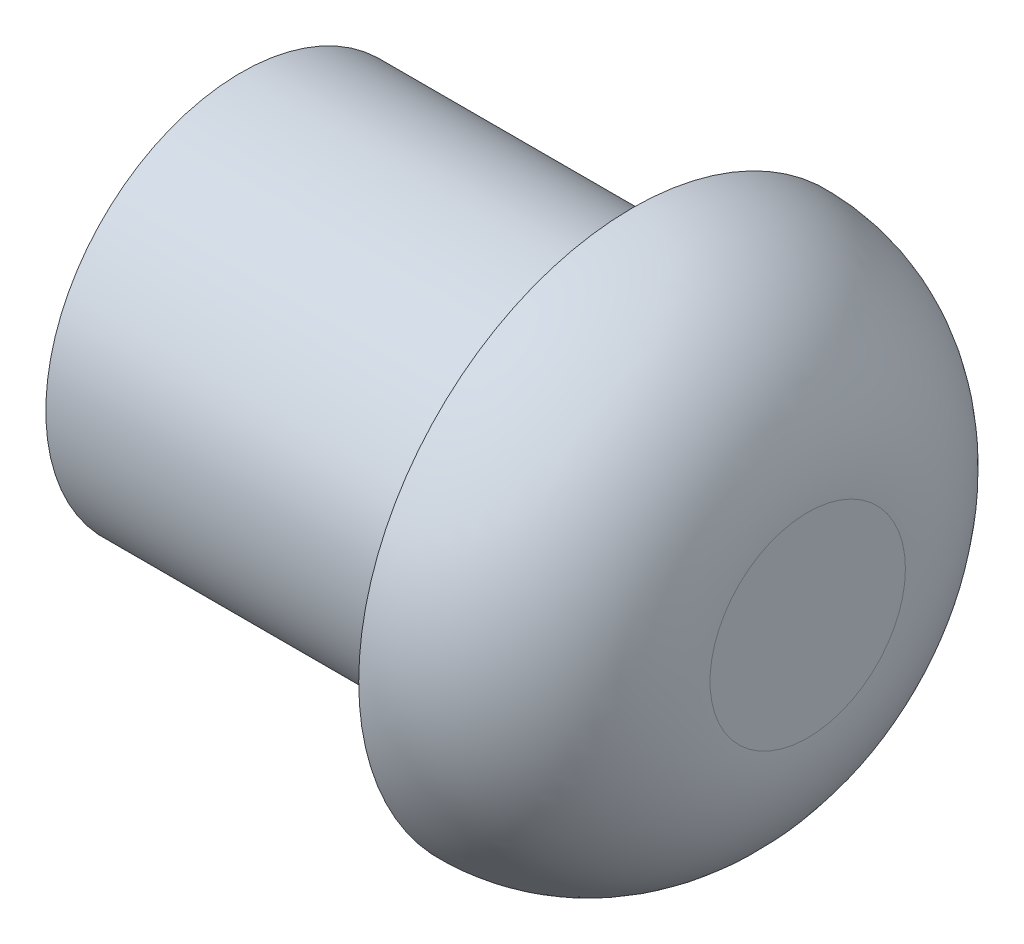
ISO-10303-21;
HEADER;
FILE_DESCRIPTION(('STEP AP214'),'2;1');
FILE_NAME('part.step','',(''),(''),'','','');
FILE_SCHEMA(('AUTOMOTIVE_DESIGN { 1 0 10303 214 1 1 1 1 }'));
ENDSEC;
DATA;
#1=APPLICATION_CONTEXT('core data for automotive mechanical design processes');
#2=APPLICATION_PROTOCOL_DEFINITION('international standard','automotive_design',2000,#1);
#3=PRODUCT_CONTEXT('',#1,'mechanical');
#4=PRODUCT('Part','Part','',(#3));
#5=PRODUCT_RELATED_PRODUCT_CATEGORY('part','',(#4));
#6=PRODUCT_DEFINITION_FORMATION('','',#4);
#7=PRODUCT_DEFINITION_CONTEXT('part definition',#1,'design');
#8=PRODUCT_DEFINITION('design','',#6,#7);
#9=PRODUCT_DEFINITION_SHAPE('','',#8);
#10=(LENGTH_UNIT() NAMED_UNIT(*) SI_UNIT(.MILLI.,.METRE.));
#11=(NAMED_UNIT(*) PLANE_ANGLE_UNIT() SI_UNIT($,.RADIAN.));
#12=(NAMED_UNIT(*) SI_UNIT($,.STERADIAN.) SOLID_ANGLE_UNIT());
#13=UNCERTAINTY_MEASURE_WITH_UNIT(LENGTH_MEASURE(1.E-05),#10,'distance_accuracy_value','');
#14=(GEOMETRIC_REPRESENTATION_CONTEXT(3) GLOBAL_UNCERTAINTY_ASSIGNED_CONTEXT((#13)) GLOBAL_UNIT_ASSIGNED_CONTEXT((#10,
#11,#12)) REPRESENTATION_CONTEXT('',''));
#15=CARTESIAN_POINT('',(0.,0.,0.));
#16=DIRECTION('',(0.,0.,1.));
#17=DIRECTION('',(1.,0.,0.));
#18=AXIS2_PLACEMENT_3D('',#15,#16,#17);
#19=CARTESIAN_POINT('',(-24.8782045373747,25.,0.));
#20=DIRECTION('',(1.,0.,0.));
#21=DIRECTION('',(0.,0.,-1.));
#22=AXIS2_PLACEMENT_3D('',#19,#20,#21);
#23=PLANE('',#22);
#24=CARTESIAN_POINT('',(-24.8782045373747,25.,0.));
#25=DIRECTION('',(1.,0.,0.));
#26=DIRECTION('',(0.,0.,-1.));
#27=AXIS2_PLACEMENT_3D('',#24,#25,#26);
#28=CIRCLE('',#27,25.);
#29=CARTESIAN_POINT('',(-24.8782045373747,25.,-25.));
#30=VERTEX_POINT('',#29);
#31=EDGE_CURVE('E10',#30,#30,#28,.T.);
#32=ORIENTED_EDGE('',*,*,#31,.F.);
#33=EDGE_LOOP('',(#32));
#34=FACE_BOUND('',#33,.T.);
#35=ADVANCED_FACE('F35',(#34),#23,.F.);
#36=CARTESIAN_POINT('',(47.5928937285212,25.,0.));
#37=DIRECTION('',(1.,0.,0.));
#38=DIRECTION('',(0.,0.,-1.));
#39=AXIS2_PLACEMENT_3D('',#36,#37,#38);
#40=CYLINDRICAL_SURFACE('',#39,25.);
#41=CARTESIAN_POINT('',(25.1217954626253,25.,0.));
#42=DIRECTION('',(1.,0.,0.));
#43=DIRECTION('',(0.,0.,-1.));
#44=AXIS2_PLACEMENT_3D('',#41,#42,#43);
#45=CIRCLE('',#44,25.);
#46=CARTESIAN_POINT('',(25.1217954626253,25.,-25.));
#47=VERTEX_POINT('',#46);
#48=EDGE_CURVE('E41',#47,#47,#45,.T.);
#49=ORIENTED_EDGE('',*,*,#48,.F.);
#50=EDGE_LOOP('',(#49));
#51=FACE_BOUND('',#50,.T.);
#52=ORIENTED_EDGE('',*,*,#31,.T.);
#53=EDGE_LOOP('',(#52));
#54=FACE_BOUND('',#53,.T.);
#55=ADVANCED_FACE('F65',(#51,#54),#40,.T.);
#56=CARTESIAN_POINT('',(25.1217954626253,0.,0.));
#57=DIRECTION('',(1.,0.,0.));
#58=DIRECTION('',(0.,0.,-1.));
#59=AXIS2_PLACEMENT_3D('',#56,#57,#58);
#60=PLANE('',#59);
#61=CARTESIAN_POINT('',(25.1217954626253,25.,0.));
#62=DIRECTION('',(1.,0.,0.));
#63=DIRECTION('',(0.,0.,-1.));
#64=AXIS2_PLACEMENT_3D('',#61,#62,#63);
#65=CIRCLE('',#64,34.9710982658959);
#66=CARTESIAN_POINT('',(25.1217954626253,25.,-34.9710982658959));
#67=VERTEX_POINT('',#66);
#68=EDGE_CURVE('E45',#67,#67,#65,.T.);
#69=ORIENTED_EDGE('',*,*,#68,.F.);
#70=EDGE_LOOP('',(#69));
#71=FACE_BOUND('',#70,.T.);
#72=ORIENTED_EDGE('',*,*,#48,.T.);
#73=EDGE_LOOP('',(#72));
#74=FACE_BOUND('',#73,.T.);
#75=ADVANCED_FACE('F60',(#71,#74),#60,.F.);
#76=CARTESIAN_POINT('',(25.1217954626253,25.,0.));
#77=DIRECTION('',(1.,0.,0.));
#78=DIRECTION('',(0.,0.,-1.));
#79=AXIS2_PLACEMENT_3D('',#76,#77,#78);
#80=DEGENERATE_TOROIDAL_SURFACE('',#79,12.5,22.471098265896,.T.);
#81=CARTESIAN_POINT('',(47.5928937285212,25.,0.));
#82=DIRECTION('',(1.,0.,0.));
#83=DIRECTION('',(0.,0.,-1.));
#84=AXIS2_PLACEMENT_3D('',#81,#82,#83);
#85=CIRCLE('',#84,12.5);
#86=CARTESIAN_POINT('',(47.5928937285212,25.,-12.5));
#87=VERTEX_POINT('',#86);
#88=EDGE_CURVE('E49',#87,#87,#85,.T.);
#89=ORIENTED_EDGE('',*,*,#88,.F.);
#90=EDGE_LOOP('',(#89));
#91=FACE_BOUND('',#90,.T.);
#92=ORIENTED_EDGE('',*,*,#68,.T.);
#93=EDGE_LOOP('',(#92));
#94=FACE_BOUND('',#93,.T.);
#95=ADVANCED_FACE('F57',(#91,#94),#80,.T.);
#96=CARTESIAN_POINT('',(47.5928937285212,12.5,0.));
#97=DIRECTION('',(-1.,0.,0.));
#98=DIRECTION('',(0.,0.,1.));
#99=AXIS2_PLACEMENT_3D('',#96,#97,#98);
#100=PLANE('',#99);
#101=ORIENTED_EDGE('',*,*,#88,.T.);
#102=EDGE_LOOP('',(#101));
#103=FACE_BOUND('',#102,.T.);
#104=ADVANCED_FACE('F55',(#103),#100,.F.);
#105=CLOSED_SHELL('',(#35,#55,#75,#95,#104));
#106=MANIFOLD_SOLID_BREP('B2',#105);
#107=ADVANCED_BREP_SHAPE_REPRESENTATION('',(#18,#106),#14);
#108=SHAPE_DEFINITION_REPRESENTATION(#9,#107);
ENDSEC;
END-ISO-10303-21;
